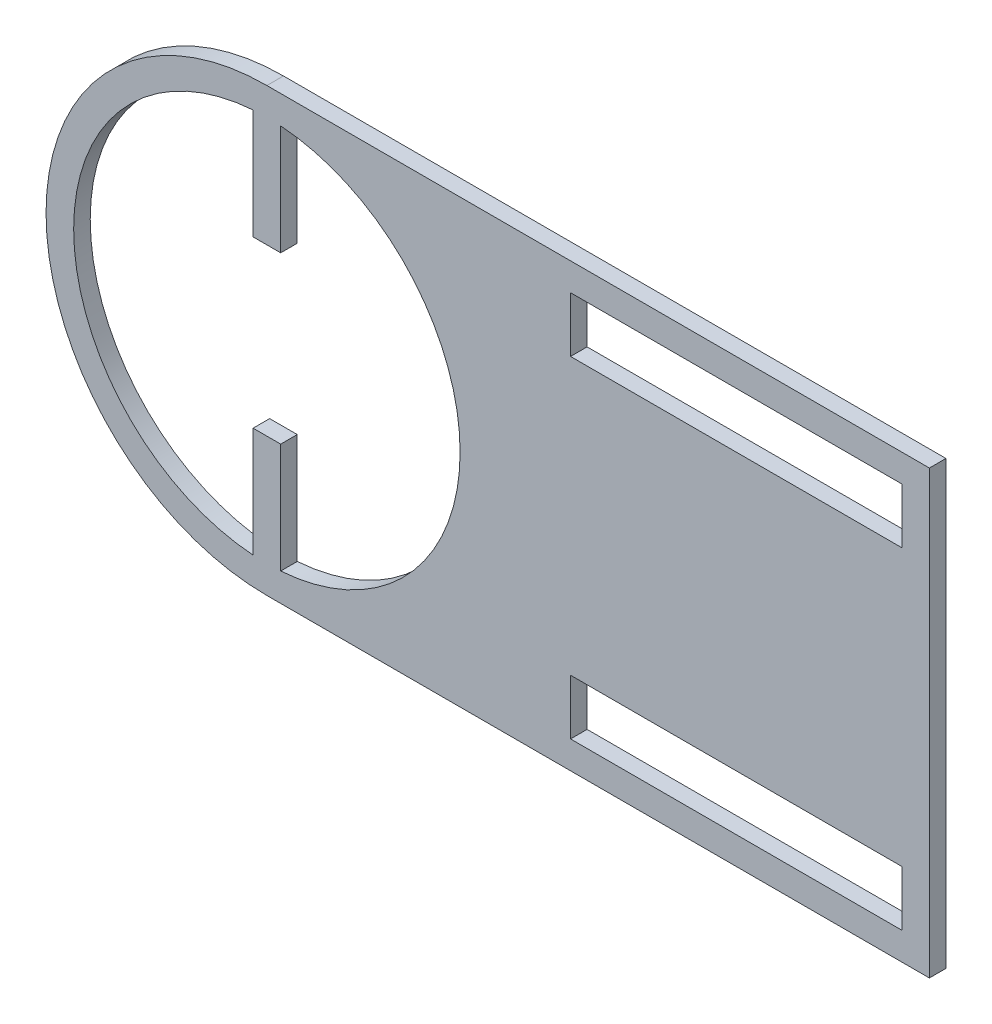
ISO-10303-21;
HEADER;
FILE_DESCRIPTION(('STEP AP214'),'2;1');
FILE_NAME('part.step','',(''),(''),'','','');
FILE_SCHEMA(('AUTOMOTIVE_DESIGN { 1 0 10303 214 1 1 1 1 }'));
ENDSEC;
DATA;
#1=APPLICATION_CONTEXT('core data for automotive mechanical design processes');
#2=APPLICATION_PROTOCOL_DEFINITION('international standard','automotive_design',2000,#1);
#3=PRODUCT_CONTEXT('',#1,'mechanical');
#4=PRODUCT('Part','Part','',(#3));
#5=PRODUCT_RELATED_PRODUCT_CATEGORY('part','',(#4));
#6=PRODUCT_DEFINITION_FORMATION('','',#4);
#7=PRODUCT_DEFINITION_CONTEXT('part definition',#1,'design');
#8=PRODUCT_DEFINITION('design','',#6,#7);
#9=PRODUCT_DEFINITION_SHAPE('','',#8);
#10=(LENGTH_UNIT() NAMED_UNIT(*) SI_UNIT(.MILLI.,.METRE.));
#11=(NAMED_UNIT(*) PLANE_ANGLE_UNIT() SI_UNIT($,.RADIAN.));
#12=(NAMED_UNIT(*) SI_UNIT($,.STERADIAN.) SOLID_ANGLE_UNIT());
#13=UNCERTAINTY_MEASURE_WITH_UNIT(LENGTH_MEASURE(1.E-05),#10,'distance_accuracy_value','');
#14=(GEOMETRIC_REPRESENTATION_CONTEXT(3) GLOBAL_UNCERTAINTY_ASSIGNED_CONTEXT((#13)) GLOBAL_UNIT_ASSIGNED_CONTEXT((#10,
#11,#12)) REPRESENTATION_CONTEXT('',''));
#15=CARTESIAN_POINT('',(0.,0.,0.));
#16=DIRECTION('',(0.,0.,1.));
#17=DIRECTION('',(1.,0.,0.));
#18=AXIS2_PLACEMENT_3D('',#15,#16,#17);
#19=CARTESIAN_POINT('',(0.,40.,3.));
#20=DIRECTION('',(0.,0.,1.));
#21=DIRECTION('',(1.,0.,0.));
#22=AXIS2_PLACEMENT_3D('',#19,#20,#21);
#23=PLANE('',#22);
#24=CARTESIAN_POINT('',(0.,40.,3.));
#25=DIRECTION('',(0.,0.,1.));
#26=DIRECTION('',(1.,0.,0.));
#27=AXIS2_PLACEMENT_3D('',#24,#25,#26);
#28=CIRCLE('',#27,40.);
#29=CARTESIAN_POINT('',(0.,80.,3.));
#30=VERTEX_POINT('',#29);
#31=CARTESIAN_POINT('',(0.,0.,3.));
#32=VERTEX_POINT('',#31);
#33=EDGE_CURVE('E296',#30,#32,#28,.T.);
#34=ORIENTED_EDGE('',*,*,#33,.T.);
#35=DIRECTION('',(1.,0.,0.));
#36=VECTOR('',#35,1.);
#37=CARTESIAN_POINT('',(0.,0.,3.));
#38=LINE('',#37,#36);
#39=CARTESIAN_POINT('',(120.,0.,3.));
#40=VERTEX_POINT('',#39);
#41=EDGE_CURVE('E299',#32,#40,#38,.T.);
#42=ORIENTED_EDGE('',*,*,#41,.T.);
#43=DIRECTION('',(0.,1.,0.));
#44=VECTOR('',#43,1.);
#45=CARTESIAN_POINT('',(120.,0.,3.));
#46=LINE('',#45,#44);
#47=CARTESIAN_POINT('',(120.,80.,3.));
#48=VERTEX_POINT('',#47);
#49=EDGE_CURVE('E302',#40,#48,#46,.T.);
#50=ORIENTED_EDGE('',*,*,#49,.T.);
#51=DIRECTION('',(-1.,0.,0.));
#52=VECTOR('',#51,1.);
#53=CARTESIAN_POINT('',(0.,80.,3.));
#54=LINE('',#53,#52);
#55=EDGE_CURVE('E304',#48,#30,#54,.T.);
#56=ORIENTED_EDGE('',*,*,#55,.T.);
#57=EDGE_LOOP('',(#34,#42,#50,#56));
#58=FACE_BOUND('',#57,.T.);
#59=DIRECTION('',(0.,-1.,0.));
#60=VECTOR('',#59,1.);
#61=CARTESIAN_POINT('',(2.5,55.,3.));
#62=LINE('',#61,#60);
#63=CARTESIAN_POINT('',(2.5,74.9106001094223,3.));
#64=VERTEX_POINT('',#63);
#65=CARTESIAN_POINT('',(2.5,55.,3.));
#66=VERTEX_POINT('',#65);
#67=EDGE_CURVE('E239',#64,#66,#62,.T.);
#68=ORIENTED_EDGE('',*,*,#67,.F.);
#69=CARTESIAN_POINT('',(0.,40.,3.));
#70=DIRECTION('',(0.,0.,1.));
#71=DIRECTION('',(1.,0.,0.));
#72=AXIS2_PLACEMENT_3D('',#69,#70,#71);
#73=CIRCLE('',#72,35.);
#74=CARTESIAN_POINT('',(2.5,5.08939989057765,3.));
#75=VERTEX_POINT('',#74);
#76=EDGE_CURVE('E237',#75,#64,#73,.T.);
#77=ORIENTED_EDGE('',*,*,#76,.F.);
#78=DIRECTION('',(0.,-1.,0.));
#79=VECTOR('',#78,1.);
#80=CARTESIAN_POINT('',(2.5,5.08939989057765,3.));
#81=LINE('',#80,#79);
#82=CARTESIAN_POINT('',(2.5,25.,3.));
#83=VERTEX_POINT('',#82);
#84=EDGE_CURVE('E253',#83,#75,#81,.T.);
#85=ORIENTED_EDGE('',*,*,#84,.F.);
#86=DIRECTION('',(1.,0.,0.));
#87=VECTOR('',#86,1.);
#88=CARTESIAN_POINT('',(2.5,25.,3.));
#89=LINE('',#88,#87);
#90=CARTESIAN_POINT('',(-2.5,25.,3.));
#91=VERTEX_POINT('',#90);
#92=EDGE_CURVE('E250',#91,#83,#89,.T.);
#93=ORIENTED_EDGE('',*,*,#92,.F.);
#94=DIRECTION('',(0.,1.,0.));
#95=VECTOR('',#94,1.);
#96=CARTESIAN_POINT('',(-2.5,5.08939989057765,3.));
#97=LINE('',#96,#95);
#98=CARTESIAN_POINT('',(-2.50000000000001,5.08939989057765,3.));
#99=VERTEX_POINT('',#98);
#100=EDGE_CURVE('E248',#99,#91,#97,.T.);
#101=ORIENTED_EDGE('',*,*,#100,.F.);
#102=CARTESIAN_POINT('',(0.,40.,3.));
#103=DIRECTION('',(0.,0.,1.));
#104=DIRECTION('',(1.,0.,0.));
#105=AXIS2_PLACEMENT_3D('',#102,#103,#104);
#106=CIRCLE('',#105,35.);
#107=CARTESIAN_POINT('',(-2.5,74.9106001094223,3.));
#108=VERTEX_POINT('',#107);
#109=EDGE_CURVE('E246',#108,#99,#106,.T.);
#110=ORIENTED_EDGE('',*,*,#109,.F.);
#111=DIRECTION('',(0.,1.,0.));
#112=VECTOR('',#111,1.);
#113=CARTESIAN_POINT('',(-2.5,55.,3.));
#114=LINE('',#113,#112);
#115=CARTESIAN_POINT('',(-2.5,55.,3.));
#116=VERTEX_POINT('',#115);
#117=EDGE_CURVE('E244',#116,#108,#114,.T.);
#118=ORIENTED_EDGE('',*,*,#117,.F.);
#119=DIRECTION('',(-1.,0.,0.));
#120=VECTOR('',#119,1.);
#121=CARTESIAN_POINT('',(2.5,55.,3.));
#122=LINE('',#121,#120);
#123=EDGE_CURVE('E242',#66,#116,#122,.T.);
#124=ORIENTED_EDGE('',*,*,#123,.F.);
#125=EDGE_LOOP('',(#68,#77,#85,#93,#101,#110,#118,#124));
#126=FACE_BOUND('',#125,.T.);
#127=DIRECTION('',(-1.,0.,0.));
#128=VECTOR('',#127,1.);
#129=CARTESIAN_POINT('',(115.,75.,3.));
#130=LINE('',#129,#128);
#131=CARTESIAN_POINT('',(115.,75.,3.));
#132=VERTEX_POINT('',#131);
#133=CARTESIAN_POINT('',(55.,75.,3.));
#134=VERTEX_POINT('',#133);
#135=EDGE_CURVE('E208',#132,#134,#130,.T.);
#136=ORIENTED_EDGE('',*,*,#135,.F.);
#137=DIRECTION('',(0.,1.,0.));
#138=VECTOR('',#137,1.);
#139=CARTESIAN_POINT('',(115.,65.,3.));
#140=LINE('',#139,#138);
#141=CARTESIAN_POINT('',(115.,65.,3.));
#142=VERTEX_POINT('',#141);
#143=EDGE_CURVE('E206',#142,#132,#140,.T.);
#144=ORIENTED_EDGE('',*,*,#143,.F.);
#145=DIRECTION('',(1.,0.,0.));
#146=VECTOR('',#145,1.);
#147=CARTESIAN_POINT('',(115.,65.,3.));
#148=LINE('',#147,#146);
#149=CARTESIAN_POINT('',(55.,65.,3.));
#150=VERTEX_POINT('',#149);
#151=EDGE_CURVE('E214',#150,#142,#148,.T.);
#152=ORIENTED_EDGE('',*,*,#151,.F.);
#153=DIRECTION('',(0.,-1.,0.));
#154=VECTOR('',#153,1.);
#155=CARTESIAN_POINT('',(55.,65.,3.));
#156=LINE('',#155,#154);
#157=EDGE_CURVE('E211',#134,#150,#156,.T.);
#158=ORIENTED_EDGE('',*,*,#157,.F.);
#159=EDGE_LOOP('',(#136,#144,#152,#158));
#160=FACE_BOUND('',#159,.T.);
#161=DIRECTION('',(-1.,0.,0.));
#162=VECTOR('',#161,1.);
#163=CARTESIAN_POINT('',(115.,15.,3.));
#164=LINE('',#163,#162);
#165=CARTESIAN_POINT('',(115.,15.,3.));
#166=VERTEX_POINT('',#165);
#167=CARTESIAN_POINT('',(55.,15.,3.));
#168=VERTEX_POINT('',#167);
#169=EDGE_CURVE('E178',#166,#168,#164,.T.);
#170=ORIENTED_EDGE('',*,*,#169,.F.);
#171=DIRECTION('',(0.,1.,0.));
#172=VECTOR('',#171,1.);
#173=CARTESIAN_POINT('',(115.,5.,3.));
#174=LINE('',#173,#172);
#175=CARTESIAN_POINT('',(115.,5.,3.));
#176=VERTEX_POINT('',#175);
#177=EDGE_CURVE('E170',#176,#166,#174,.T.);
#178=ORIENTED_EDGE('',*,*,#177,.F.);
#179=DIRECTION('',(1.,0.,0.));
#180=VECTOR('',#179,1.);
#181=CARTESIAN_POINT('',(115.,5.,3.));
#182=LINE('',#181,#180);
#183=CARTESIAN_POINT('',(55.,4.99999999999999,3.));
#184=VERTEX_POINT('',#183);
#185=EDGE_CURVE('E192',#184,#176,#182,.T.);
#186=ORIENTED_EDGE('',*,*,#185,.F.);
#187=DIRECTION('',(0.,-1.,0.));
#188=VECTOR('',#187,1.);
#189=CARTESIAN_POINT('',(55.,4.99999999999999,3.));
#190=LINE('',#189,#188);
#191=EDGE_CURVE('E190',#168,#184,#190,.T.);
#192=ORIENTED_EDGE('',*,*,#191,.F.);
#193=EDGE_LOOP('',(#170,#178,#186,#192));
#194=FACE_BOUND('',#193,.T.);
#195=ADVANCED_FACE('F33',(#58,#126,#160,#194),#23,.T.);
#196=CARTESIAN_POINT('',(0.,40.,0.));
#197=DIRECTION('',(0.,0.,1.));
#198=DIRECTION('',(1.,0.,0.));
#199=AXIS2_PLACEMENT_3D('',#196,#197,#198);
#200=PLANE('',#199);
#201=DIRECTION('',(0.,1.,0.));
#202=VECTOR('',#201,1.);
#203=CARTESIAN_POINT('',(115.,65.,0.));
#204=LINE('',#203,#202);
#205=CARTESIAN_POINT('',(115.,65.,0.));
#206=VERTEX_POINT('',#205);
#207=CARTESIAN_POINT('',(115.,75.,0.));
#208=VERTEX_POINT('',#207);
#209=EDGE_CURVE('E186',#206,#208,#204,.T.);
#210=ORIENTED_EDGE('',*,*,#209,.T.);
#211=DIRECTION('',(-1.,0.,0.));
#212=VECTOR('',#211,1.);
#213=CARTESIAN_POINT('',(115.,75.,0.));
#214=LINE('',#213,#212);
#215=CARTESIAN_POINT('',(55.,75.,0.));
#216=VERTEX_POINT('',#215);
#217=EDGE_CURVE('E219',#208,#216,#214,.T.);
#218=ORIENTED_EDGE('',*,*,#217,.T.);
#219=DIRECTION('',(0.,-1.,0.));
#220=VECTOR('',#219,1.);
#221=CARTESIAN_POINT('',(55.,65.,0.));
#222=LINE('',#221,#220);
#223=CARTESIAN_POINT('',(55.,65.,0.));
#224=VERTEX_POINT('',#223);
#225=EDGE_CURVE('E222',#216,#224,#222,.T.);
#226=ORIENTED_EDGE('',*,*,#225,.T.);
#227=DIRECTION('',(1.,0.,0.));
#228=VECTOR('',#227,1.);
#229=CARTESIAN_POINT('',(115.,65.,0.));
#230=LINE('',#229,#228);
#231=EDGE_CURVE('E209',#224,#206,#230,.T.);
#232=ORIENTED_EDGE('',*,*,#231,.T.);
#233=EDGE_LOOP('',(#210,#218,#226,#232));
#234=FACE_BOUND('',#233,.T.);
#235=CARTESIAN_POINT('',(0.,40.,0.));
#236=DIRECTION('',(0.,0.,1.));
#237=DIRECTION('',(1.,0.,0.));
#238=AXIS2_PLACEMENT_3D('',#235,#236,#237);
#239=CIRCLE('',#238,40.);
#240=CARTESIAN_POINT('',(0.,80.,0.));
#241=VERTEX_POINT('',#240);
#242=CARTESIAN_POINT('',(0.,0.,0.));
#243=VERTEX_POINT('',#242);
#244=EDGE_CURVE('E295',#241,#243,#239,.T.);
#245=ORIENTED_EDGE('',*,*,#244,.F.);
#246=DIRECTION('',(-1.,0.,0.));
#247=VECTOR('',#246,1.);
#248=CARTESIAN_POINT('',(0.,80.,0.));
#249=LINE('',#248,#247);
#250=CARTESIAN_POINT('',(120.,80.,0.));
#251=VERTEX_POINT('',#250);
#252=EDGE_CURVE('E300',#251,#241,#249,.T.);
#253=ORIENTED_EDGE('',*,*,#252,.F.);
#254=DIRECTION('',(0.,1.,0.));
#255=VECTOR('',#254,1.);
#256=CARTESIAN_POINT('',(120.,0.,0.));
#257=LINE('',#256,#255);
#258=CARTESIAN_POINT('',(120.,0.,0.));
#259=VERTEX_POINT('',#258);
#260=EDGE_CURVE('E311',#259,#251,#257,.T.);
#261=ORIENTED_EDGE('',*,*,#260,.F.);
#262=DIRECTION('',(1.,0.,0.));
#263=VECTOR('',#262,1.);
#264=CARTESIAN_POINT('',(0.,0.,0.));
#265=LINE('',#264,#263);
#266=EDGE_CURVE('E309',#243,#259,#265,.T.);
#267=ORIENTED_EDGE('',*,*,#266,.F.);
#268=EDGE_LOOP('',(#245,#253,#261,#267));
#269=FACE_BOUND('',#268,.T.);
#270=CARTESIAN_POINT('',(0.,40.,0.));
#271=DIRECTION('',(0.,0.,1.));
#272=DIRECTION('',(1.,0.,0.));
#273=AXIS2_PLACEMENT_3D('',#270,#271,#272);
#274=CIRCLE('',#273,35.);
#275=CARTESIAN_POINT('',(2.5,5.08939989057765,0.));
#276=VERTEX_POINT('',#275);
#277=CARTESIAN_POINT('',(2.5,74.9106001094223,0.));
#278=VERTEX_POINT('',#277);
#279=EDGE_CURVE('E236',#276,#278,#274,.T.);
#280=ORIENTED_EDGE('',*,*,#279,.T.);
#281=DIRECTION('',(0.,-1.,0.));
#282=VECTOR('',#281,1.);
#283=CARTESIAN_POINT('',(2.5,55.,0.));
#284=LINE('',#283,#282);
#285=CARTESIAN_POINT('',(2.5,55.,0.));
#286=VERTEX_POINT('',#285);
#287=EDGE_CURVE('E258',#278,#286,#284,.T.);
#288=ORIENTED_EDGE('',*,*,#287,.T.);
#289=DIRECTION('',(-1.,0.,0.));
#290=VECTOR('',#289,1.);
#291=CARTESIAN_POINT('',(2.5,55.,0.));
#292=LINE('',#291,#290);
#293=CARTESIAN_POINT('',(-2.5,55.,0.));
#294=VERTEX_POINT('',#293);
#295=EDGE_CURVE('E261',#286,#294,#292,.T.);
#296=ORIENTED_EDGE('',*,*,#295,.T.);
#297=DIRECTION('',(0.,1.,0.));
#298=VECTOR('',#297,1.);
#299=CARTESIAN_POINT('',(-2.5,55.,0.));
#300=LINE('',#299,#298);
#301=CARTESIAN_POINT('',(-2.5,74.9106001094223,0.));
#302=VERTEX_POINT('',#301);
#303=EDGE_CURVE('E264',#294,#302,#300,.T.);
#304=ORIENTED_EDGE('',*,*,#303,.T.);
#305=CARTESIAN_POINT('',(0.,40.,0.));
#306=DIRECTION('',(0.,0.,1.));
#307=DIRECTION('',(1.,0.,0.));
#308=AXIS2_PLACEMENT_3D('',#305,#306,#307);
#309=CIRCLE('',#308,35.);
#310=CARTESIAN_POINT('',(-2.50000000000001,5.08939989057765,0.));
#311=VERTEX_POINT('',#310);
#312=EDGE_CURVE('E267',#302,#311,#309,.T.);
#313=ORIENTED_EDGE('',*,*,#312,.T.);
#314=DIRECTION('',(0.,1.,0.));
#315=VECTOR('',#314,1.);
#316=CARTESIAN_POINT('',(-2.5,5.08939989057765,0.));
#317=LINE('',#316,#315);
#318=CARTESIAN_POINT('',(-2.5,25.,0.));
#319=VERTEX_POINT('',#318);
#320=EDGE_CURVE('E270',#311,#319,#317,.T.);
#321=ORIENTED_EDGE('',*,*,#320,.T.);
#322=DIRECTION('',(1.,0.,0.));
#323=VECTOR('',#322,1.);
#324=CARTESIAN_POINT('',(2.5,25.,0.));
#325=LINE('',#324,#323);
#326=CARTESIAN_POINT('',(2.5,25.,0.));
#327=VERTEX_POINT('',#326);
#328=EDGE_CURVE('E273',#319,#327,#325,.T.);
#329=ORIENTED_EDGE('',*,*,#328,.T.);
#330=DIRECTION('',(0.,-1.,0.));
#331=VECTOR('',#330,1.);
#332=CARTESIAN_POINT('',(2.5,5.08939989057765,0.));
#333=LINE('',#332,#331);
#334=EDGE_CURVE('E240',#327,#276,#333,.T.);
#335=ORIENTED_EDGE('',*,*,#334,.T.);
#336=EDGE_LOOP('',(#280,#288,#296,#304,#313,#321,#329,#335));
#337=FACE_BOUND('',#336,.T.);
#338=DIRECTION('',(0.,1.,0.));
#339=VECTOR('',#338,1.);
#340=CARTESIAN_POINT('',(115.,5.,0.));
#341=LINE('',#340,#339);
#342=CARTESIAN_POINT('',(115.,5.,0.));
#343=VERTEX_POINT('',#342);
#344=CARTESIAN_POINT('',(115.,15.,0.));
#345=VERTEX_POINT('',#344);
#346=EDGE_CURVE('E56',#343,#345,#341,.T.);
#347=ORIENTED_EDGE('',*,*,#346,.T.);
#348=DIRECTION('',(-1.,0.,0.));
#349=VECTOR('',#348,1.);
#350=CARTESIAN_POINT('',(115.,15.,0.));
#351=LINE('',#350,#349);
#352=CARTESIAN_POINT('',(55.,15.,0.));
#353=VERTEX_POINT('',#352);
#354=EDGE_CURVE('E185',#345,#353,#351,.T.);
#355=ORIENTED_EDGE('',*,*,#354,.T.);
#356=DIRECTION('',(0.,-1.,0.));
#357=VECTOR('',#356,1.);
#358=CARTESIAN_POINT('',(55.,4.99999999999999,0.));
#359=LINE('',#358,#357);
#360=CARTESIAN_POINT('',(55.,4.99999999999999,0.));
#361=VERTEX_POINT('',#360);
#362=EDGE_CURVE('E198',#353,#361,#359,.T.);
#363=ORIENTED_EDGE('',*,*,#362,.T.);
#364=DIRECTION('',(1.,0.,0.));
#365=VECTOR('',#364,1.);
#366=CARTESIAN_POINT('',(115.,5.,0.));
#367=LINE('',#366,#365);
#368=EDGE_CURVE('E179',#361,#343,#367,.T.);
#369=ORIENTED_EDGE('',*,*,#368,.T.);
#370=EDGE_LOOP('',(#347,#355,#363,#369));
#371=FACE_BOUND('',#370,.T.);
#372=ADVANCED_FACE('F329',(#234,#269,#337,#371),#200,.F.);
#373=CARTESIAN_POINT('',(0.,40.,3.));
#374=DIRECTION('',(0.,0.,-1.));
#375=DIRECTION('',(-1.,0.,0.));
#376=AXIS2_PLACEMENT_3D('',#373,#374,#375);
#377=CYLINDRICAL_SURFACE('',#376,40.);
#378=ORIENTED_EDGE('',*,*,#244,.T.);
#379=DIRECTION('',(0.,0.,-1.));
#380=VECTOR('',#379,1.);
#381=CARTESIAN_POINT('',(0.,0.,3.));
#382=LINE('',#381,#380);
#383=EDGE_CURVE('E11',#32,#243,#382,.T.);
#384=ORIENTED_EDGE('',*,*,#383,.F.);
#385=ORIENTED_EDGE('',*,*,#33,.F.);
#386=DIRECTION('',(0.,0.,-1.));
#387=VECTOR('',#386,1.);
#388=CARTESIAN_POINT('',(0.,80.,3.));
#389=LINE('',#388,#387);
#390=EDGE_CURVE('E306',#30,#241,#389,.T.);
#391=ORIENTED_EDGE('',*,*,#390,.T.);
#392=EDGE_LOOP('',(#378,#384,#385,#391));
#393=FACE_BOUND('',#392,.T.);
#394=ADVANCED_FACE('F35',(#393),#377,.T.);
#395=CARTESIAN_POINT('',(0.,0.,3.));
#396=DIRECTION('',(0.,1.,0.));
#397=DIRECTION('',(0.,0.,1.));
#398=AXIS2_PLACEMENT_3D('',#395,#396,#397);
#399=PLANE('',#398);
#400=ORIENTED_EDGE('',*,*,#266,.T.);
#401=DIRECTION('',(0.,0.,-1.));
#402=VECTOR('',#401,1.);
#403=CARTESIAN_POINT('',(120.,0.,3.));
#404=LINE('',#403,#402);
#405=EDGE_CURVE('E41',#40,#259,#404,.T.);
#406=ORIENTED_EDGE('',*,*,#405,.F.);
#407=ORIENTED_EDGE('',*,*,#41,.F.);
#408=ORIENTED_EDGE('',*,*,#383,.T.);
#409=EDGE_LOOP('',(#400,#406,#407,#408));
#410=FACE_BOUND('',#409,.T.);
#411=ADVANCED_FACE('F340',(#410),#399,.F.);
#412=CARTESIAN_POINT('',(120.,0.,3.));
#413=DIRECTION('',(-1.,0.,0.));
#414=DIRECTION('',(0.,0.,1.));
#415=AXIS2_PLACEMENT_3D('',#412,#413,#414);
#416=PLANE('',#415);
#417=ORIENTED_EDGE('',*,*,#260,.T.);
#418=DIRECTION('',(0.,0.,-1.));
#419=VECTOR('',#418,1.);
#420=CARTESIAN_POINT('',(120.,80.,3.));
#421=LINE('',#420,#419);
#422=EDGE_CURVE('E316',#48,#251,#421,.T.);
#423=ORIENTED_EDGE('',*,*,#422,.F.);
#424=ORIENTED_EDGE('',*,*,#49,.F.);
#425=ORIENTED_EDGE('',*,*,#405,.T.);
#426=EDGE_LOOP('',(#417,#423,#424,#425));
#427=FACE_BOUND('',#426,.T.);
#428=ADVANCED_FACE('F323',(#427),#416,.F.);
#429=CARTESIAN_POINT('',(0.,80.,3.));
#430=DIRECTION('',(0.,-1.,0.));
#431=DIRECTION('',(0.,0.,-1.));
#432=AXIS2_PLACEMENT_3D('',#429,#430,#431);
#433=PLANE('',#432);
#434=ORIENTED_EDGE('',*,*,#252,.T.);
#435=ORIENTED_EDGE('',*,*,#390,.F.);
#436=ORIENTED_EDGE('',*,*,#55,.F.);
#437=ORIENTED_EDGE('',*,*,#422,.T.);
#438=EDGE_LOOP('',(#434,#435,#436,#437));
#439=FACE_BOUND('',#438,.T.);
#440=ADVANCED_FACE('F333',(#439),#433,.F.);
#441=CARTESIAN_POINT('',(0.,40.,3.));
#442=DIRECTION('',(0.,0.,-1.));
#443=DIRECTION('',(-1.,0.,0.));
#444=AXIS2_PLACEMENT_3D('',#441,#442,#443);
#445=CYLINDRICAL_SURFACE('',#444,35.);
#446=ORIENTED_EDGE('',*,*,#279,.F.);
#447=DIRECTION('',(0.,0.,-1.));
#448=VECTOR('',#447,1.);
#449=CARTESIAN_POINT('',(2.5,5.08939989057765,3.));
#450=LINE('',#449,#448);
#451=EDGE_CURVE('E255',#75,#276,#450,.T.);
#452=ORIENTED_EDGE('',*,*,#451,.F.);
#453=ORIENTED_EDGE('',*,*,#76,.T.);
#454=DIRECTION('',(0.,0.,-1.));
#455=VECTOR('',#454,1.);
#456=CARTESIAN_POINT('',(2.5,74.9106001094223,3.));
#457=LINE('',#456,#455);
#458=EDGE_CURVE('E292',#64,#278,#457,.T.);
#459=ORIENTED_EDGE('',*,*,#458,.T.);
#460=EDGE_LOOP('',(#446,#452,#453,#459));
#461=FACE_BOUND('',#460,.T.);
#462=ADVANCED_FACE('F355',(#461),#445,.F.);
#463=CARTESIAN_POINT('',(2.5,55.,3.));
#464=DIRECTION('',(1.,0.,0.));
#465=DIRECTION('',(0.,0.,-1.));
#466=AXIS2_PLACEMENT_3D('',#463,#464,#465);
#467=PLANE('',#466);
#468=ORIENTED_EDGE('',*,*,#287,.F.);
#469=ORIENTED_EDGE('',*,*,#458,.F.);
#470=ORIENTED_EDGE('',*,*,#67,.T.);
#471=DIRECTION('',(0.,0.,-1.));
#472=VECTOR('',#471,1.);
#473=CARTESIAN_POINT('',(2.5,55.,3.));
#474=LINE('',#473,#472);
#475=EDGE_CURVE('E290',#66,#286,#474,.T.);
#476=ORIENTED_EDGE('',*,*,#475,.T.);
#477=EDGE_LOOP('',(#468,#469,#470,#476));
#478=FACE_BOUND('',#477,.T.);
#479=ADVANCED_FACE('F362',(#478),#467,.T.);
#480=CARTESIAN_POINT('',(2.5,55.,3.));
#481=DIRECTION('',(0.,-1.,0.));
#482=DIRECTION('',(0.,0.,-1.));
#483=AXIS2_PLACEMENT_3D('',#480,#481,#482);
#484=PLANE('',#483);
#485=ORIENTED_EDGE('',*,*,#295,.F.);
#486=ORIENTED_EDGE('',*,*,#475,.F.);
#487=ORIENTED_EDGE('',*,*,#123,.T.);
#488=DIRECTION('',(0.,0.,-1.));
#489=VECTOR('',#488,1.);
#490=CARTESIAN_POINT('',(-2.5,55.,3.));
#491=LINE('',#490,#489);
#492=EDGE_CURVE('E288',#116,#294,#491,.T.);
#493=ORIENTED_EDGE('',*,*,#492,.T.);
#494=EDGE_LOOP('',(#485,#486,#487,#493));
#495=FACE_BOUND('',#494,.T.);
#496=ADVANCED_FACE('F367',(#495),#484,.T.);
#497=CARTESIAN_POINT('',(-2.5,55.,3.));
#498=DIRECTION('',(-1.,0.,0.));
#499=DIRECTION('',(0.,-1.,0.));
#500=AXIS2_PLACEMENT_3D('',#497,#498,#499);
#501=PLANE('',#500);
#502=ORIENTED_EDGE('',*,*,#303,.F.);
#503=ORIENTED_EDGE('',*,*,#492,.F.);
#504=ORIENTED_EDGE('',*,*,#117,.T.);
#505=DIRECTION('',(0.,0.,-1.));
#506=VECTOR('',#505,1.);
#507=CARTESIAN_POINT('',(-2.5,74.9106001094223,3.));
#508=LINE('',#507,#506);
#509=EDGE_CURVE('E286',#108,#302,#508,.T.);
#510=ORIENTED_EDGE('',*,*,#509,.T.);
#511=EDGE_LOOP('',(#502,#503,#504,#510));
#512=FACE_BOUND('',#511,.T.);
#513=ADVANCED_FACE('F394',(#512),#501,.T.);
#514=CARTESIAN_POINT('',(0.,40.,3.));
#515=DIRECTION('',(0.,0.,-1.));
#516=DIRECTION('',(-1.,0.,0.));
#517=AXIS2_PLACEMENT_3D('',#514,#515,#516);
#518=CYLINDRICAL_SURFACE('',#517,35.);
#519=ORIENTED_EDGE('',*,*,#312,.F.);
#520=ORIENTED_EDGE('',*,*,#509,.F.);
#521=ORIENTED_EDGE('',*,*,#109,.T.);
#522=DIRECTION('',(0.,0.,-1.));
#523=VECTOR('',#522,1.);
#524=CARTESIAN_POINT('',(-2.50000000000001,5.08939989057765,3.));
#525=LINE('',#524,#523);
#526=EDGE_CURVE('E284',#99,#311,#525,.T.);
#527=ORIENTED_EDGE('',*,*,#526,.T.);
#528=EDGE_LOOP('',(#519,#520,#521,#527));
#529=FACE_BOUND('',#528,.T.);
#530=ADVANCED_FACE('F399',(#529),#518,.F.);
#531=CARTESIAN_POINT('',(-2.5,5.08939989057765,3.));
#532=DIRECTION('',(-1.,0.,0.));
#533=DIRECTION('',(0.,-1.,0.));
#534=AXIS2_PLACEMENT_3D('',#531,#532,#533);
#535=PLANE('',#534);
#536=ORIENTED_EDGE('',*,*,#320,.F.);
#537=ORIENTED_EDGE('',*,*,#526,.F.);
#538=ORIENTED_EDGE('',*,*,#100,.T.);
#539=DIRECTION('',(0.,0.,-1.));
#540=VECTOR('',#539,1.);
#541=CARTESIAN_POINT('',(-2.5,25.,3.));
#542=LINE('',#541,#540);
#543=EDGE_CURVE('E282',#91,#319,#542,.T.);
#544=ORIENTED_EDGE('',*,*,#543,.T.);
#545=EDGE_LOOP('',(#536,#537,#538,#544));
#546=FACE_BOUND('',#545,.T.);
#547=ADVANCED_FACE('F402',(#546),#535,.T.);
#548=CARTESIAN_POINT('',(2.5,25.,3.));
#549=DIRECTION('',(0.,1.,0.));
#550=DIRECTION('',(0.,0.,1.));
#551=AXIS2_PLACEMENT_3D('',#548,#549,#550);
#552=PLANE('',#551);
#553=ORIENTED_EDGE('',*,*,#328,.F.);
#554=ORIENTED_EDGE('',*,*,#543,.F.);
#555=ORIENTED_EDGE('',*,*,#92,.T.);
#556=DIRECTION('',(0.,0.,-1.));
#557=VECTOR('',#556,1.);
#558=CARTESIAN_POINT('',(2.5,25.,3.));
#559=LINE('',#558,#557);
#560=EDGE_CURVE('E280',#83,#327,#559,.T.);
#561=ORIENTED_EDGE('',*,*,#560,.T.);
#562=EDGE_LOOP('',(#553,#554,#555,#561));
#563=FACE_BOUND('',#562,.T.);
#564=ADVANCED_FACE('F381',(#563),#552,.T.);
#565=CARTESIAN_POINT('',(2.5,5.08939989057765,3.));
#566=DIRECTION('',(1.,0.,0.));
#567=DIRECTION('',(0.,1.,0.));
#568=AXIS2_PLACEMENT_3D('',#565,#566,#567);
#569=PLANE('',#568);
#570=ORIENTED_EDGE('',*,*,#334,.F.);
#571=ORIENTED_EDGE('',*,*,#560,.F.);
#572=ORIENTED_EDGE('',*,*,#84,.T.);
#573=ORIENTED_EDGE('',*,*,#451,.T.);
#574=EDGE_LOOP('',(#570,#571,#572,#573));
#575=FACE_BOUND('',#574,.T.);
#576=ADVANCED_FACE('F374',(#575),#569,.T.);
#577=CARTESIAN_POINT('',(115.,65.,3.));
#578=DIRECTION('',(-1.,0.,0.));
#579=DIRECTION('',(0.,0.,1.));
#580=AXIS2_PLACEMENT_3D('',#577,#578,#579);
#581=PLANE('',#580);
#582=ORIENTED_EDGE('',*,*,#209,.F.);
#583=DIRECTION('',(0.,0.,-1.));
#584=VECTOR('',#583,1.);
#585=CARTESIAN_POINT('',(115.,65.,3.));
#586=LINE('',#585,#584);
#587=EDGE_CURVE('E216',#142,#206,#586,.T.);
#588=ORIENTED_EDGE('',*,*,#587,.F.);
#589=ORIENTED_EDGE('',*,*,#143,.T.);
#590=DIRECTION('',(0.,0.,-1.));
#591=VECTOR('',#590,1.);
#592=CARTESIAN_POINT('',(115.,75.,3.));
#593=LINE('',#592,#591);
#594=EDGE_CURVE('E233',#132,#208,#593,.T.);
#595=ORIENTED_EDGE('',*,*,#594,.T.);
#596=EDGE_LOOP('',(#582,#588,#589,#595));
#597=FACE_BOUND('',#596,.T.);
#598=ADVANCED_FACE('F447',(#597),#581,.T.);
#599=CARTESIAN_POINT('',(115.,75.,3.));
#600=DIRECTION('',(0.,-1.,0.));
#601=DIRECTION('',(1.,0.,0.));
#602=AXIS2_PLACEMENT_3D('',#599,#600,#601);
#603=PLANE('',#602);
#604=ORIENTED_EDGE('',*,*,#217,.F.);
#605=ORIENTED_EDGE('',*,*,#594,.F.);
#606=ORIENTED_EDGE('',*,*,#135,.T.);
#607=DIRECTION('',(0.,0.,-1.));
#608=VECTOR('',#607,1.);
#609=CARTESIAN_POINT('',(55.,75.,3.));
#610=LINE('',#609,#608);
#611=EDGE_CURVE('E231',#134,#216,#610,.T.);
#612=ORIENTED_EDGE('',*,*,#611,.T.);
#613=EDGE_LOOP('',(#604,#605,#606,#612));
#614=FACE_BOUND('',#613,.T.);
#615=ADVANCED_FACE('F455',(#614),#603,.T.);
#616=CARTESIAN_POINT('',(55.,65.,3.));
#617=DIRECTION('',(1.,0.,0.));
#618=DIRECTION('',(0.,0.,-1.));
#619=AXIS2_PLACEMENT_3D('',#616,#617,#618);
#620=PLANE('',#619);
#621=ORIENTED_EDGE('',*,*,#225,.F.);
#622=ORIENTED_EDGE('',*,*,#611,.F.);
#623=ORIENTED_EDGE('',*,*,#157,.T.);
#624=DIRECTION('',(0.,0.,-1.));
#625=VECTOR('',#624,1.);
#626=CARTESIAN_POINT('',(55.,65.,3.));
#627=LINE('',#626,#625);
#628=EDGE_CURVE('E229',#150,#224,#627,.T.);
#629=ORIENTED_EDGE('',*,*,#628,.T.);
#630=EDGE_LOOP('',(#621,#622,#623,#629));
#631=FACE_BOUND('',#630,.T.);
#632=ADVANCED_FACE('F465',(#631),#620,.T.);
#633=CARTESIAN_POINT('',(115.,65.,3.));
#634=DIRECTION('',(0.,1.,0.));
#635=DIRECTION('',(-1.,0.,0.));
#636=AXIS2_PLACEMENT_3D('',#633,#634,#635);
#637=PLANE('',#636);
#638=ORIENTED_EDGE('',*,*,#231,.F.);
#639=ORIENTED_EDGE('',*,*,#628,.F.);
#640=ORIENTED_EDGE('',*,*,#151,.T.);
#641=ORIENTED_EDGE('',*,*,#587,.T.);
#642=EDGE_LOOP('',(#638,#639,#640,#641));
#643=FACE_BOUND('',#642,.T.);
#644=ADVANCED_FACE('F475',(#643),#637,.T.);
#645=CARTESIAN_POINT('',(115.,5.,3.));
#646=DIRECTION('',(-1.,0.,0.));
#647=DIRECTION('',(0.,0.,1.));
#648=AXIS2_PLACEMENT_3D('',#645,#646,#647);
#649=PLANE('',#648);
#650=ORIENTED_EDGE('',*,*,#346,.F.);
#651=DIRECTION('',(0.,0.,-1.));
#652=VECTOR('',#651,1.);
#653=CARTESIAN_POINT('',(115.,5.,3.));
#654=LINE('',#653,#652);
#655=EDGE_CURVE('E174',#176,#343,#654,.T.);
#656=ORIENTED_EDGE('',*,*,#655,.F.);
#657=ORIENTED_EDGE('',*,*,#177,.T.);
#658=DIRECTION('',(0.,0.,-1.));
#659=VECTOR('',#658,1.);
#660=CARTESIAN_POINT('',(115.,15.,3.));
#661=LINE('',#660,#659);
#662=EDGE_CURVE('E173',#166,#345,#661,.T.);
#663=ORIENTED_EDGE('',*,*,#662,.T.);
#664=EDGE_LOOP('',(#650,#656,#657,#663));
#665=FACE_BOUND('',#664,.T.);
#666=ADVANCED_FACE('F172',(#665),#649,.T.);
#667=CARTESIAN_POINT('',(115.,15.,3.));
#668=DIRECTION('',(0.,-1.,0.));
#669=DIRECTION('',(1.,0.,0.));
#670=AXIS2_PLACEMENT_3D('',#667,#668,#669);
#671=PLANE('',#670);
#672=ORIENTED_EDGE('',*,*,#354,.F.);
#673=ORIENTED_EDGE('',*,*,#662,.F.);
#674=ORIENTED_EDGE('',*,*,#169,.T.);
#675=DIRECTION('',(0.,0.,-1.));
#676=VECTOR('',#675,1.);
#677=CARTESIAN_POINT('',(55.,15.,3.));
#678=LINE('',#677,#676);
#679=EDGE_CURVE('E187',#168,#353,#678,.T.);
#680=ORIENTED_EDGE('',*,*,#679,.T.);
#681=EDGE_LOOP('',(#672,#673,#674,#680));
#682=FACE_BOUND('',#681,.T.);
#683=ADVANCED_FACE('F182',(#682),#671,.T.);
#684=CARTESIAN_POINT('',(55.,4.99999999999999,3.));
#685=DIRECTION('',(1.,0.,0.));
#686=DIRECTION('',(0.,0.,-1.));
#687=AXIS2_PLACEMENT_3D('',#684,#685,#686);
#688=PLANE('',#687);
#689=ORIENTED_EDGE('',*,*,#362,.F.);
#690=ORIENTED_EDGE('',*,*,#679,.F.);
#691=ORIENTED_EDGE('',*,*,#191,.T.);
#692=DIRECTION('',(0.,0.,-1.));
#693=VECTOR('',#692,1.);
#694=CARTESIAN_POINT('',(55.,4.99999999999999,3.));
#695=LINE('',#694,#693);
#696=EDGE_CURVE('E48',#184,#361,#695,.T.);
#697=ORIENTED_EDGE('',*,*,#696,.T.);
#698=EDGE_LOOP('',(#689,#690,#691,#697));
#699=FACE_BOUND('',#698,.T.);
#700=ADVANCED_FACE('F502',(#699),#688,.T.);
#701=CARTESIAN_POINT('',(115.,5.,3.));
#702=DIRECTION('',(0.,1.,0.));
#703=DIRECTION('',(-1.,0.,0.));
#704=AXIS2_PLACEMENT_3D('',#701,#702,#703);
#705=PLANE('',#704);
#706=ORIENTED_EDGE('',*,*,#368,.F.);
#707=ORIENTED_EDGE('',*,*,#696,.F.);
#708=ORIENTED_EDGE('',*,*,#185,.T.);
#709=ORIENTED_EDGE('',*,*,#655,.T.);
#710=EDGE_LOOP('',(#706,#707,#708,#709));
#711=FACE_BOUND('',#710,.T.);
#712=ADVANCED_FACE('F511',(#711),#705,.T.);
#713=CLOSED_SHELL('',(#195,#372,#394,#411,#428,#440,#462,#479,#496,#513,#530,#547,#564,#576,
#598,#615,#632,#644,#666,#683,#700,#712));
#714=MANIFOLD_SOLID_BREP('B2',#713);
#715=ADVANCED_BREP_SHAPE_REPRESENTATION('',(#18,#714),#14);
#716=SHAPE_DEFINITION_REPRESENTATION(#9,#715);
ENDSEC;
END-ISO-10303-21;
